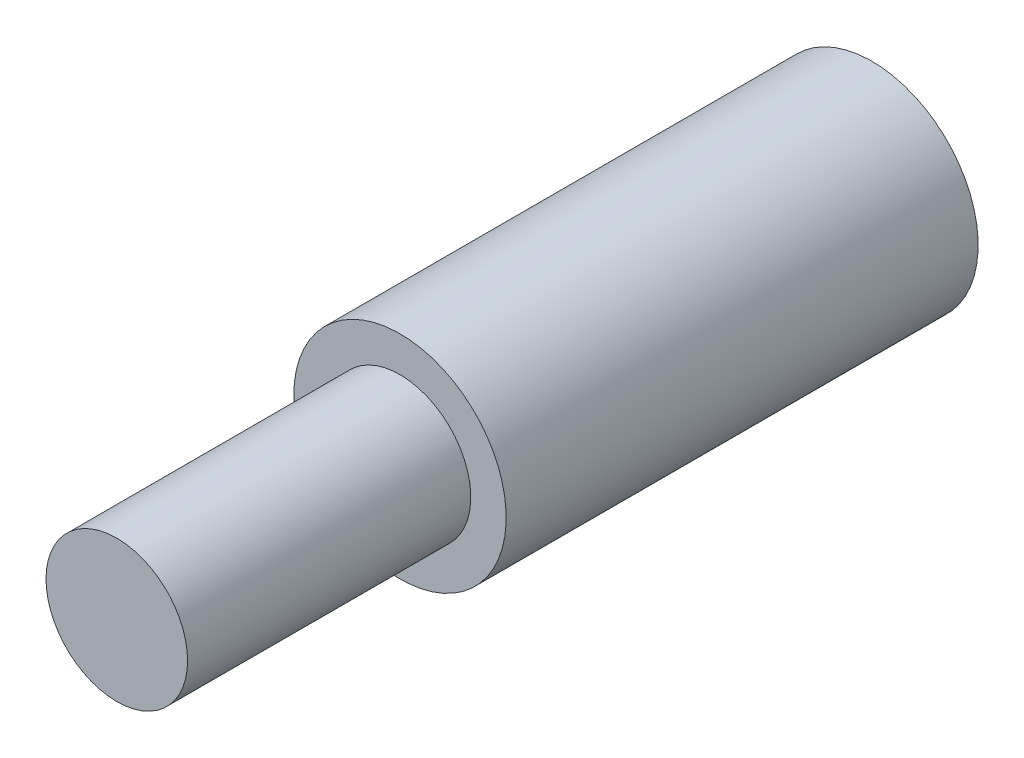
ISO-10303-21;
HEADER;
FILE_DESCRIPTION(('STEP AP214'),'2;1');
FILE_NAME('part.step','',(''),(''),'','','');
FILE_SCHEMA(('AUTOMOTIVE_DESIGN { 1 0 10303 214 1 1 1 1 }'));
ENDSEC;
DATA;
#1=APPLICATION_CONTEXT('core data for automotive mechanical design processes');
#2=APPLICATION_PROTOCOL_DEFINITION('international standard','automotive_design',2000,#1);
#3=PRODUCT_CONTEXT('',#1,'mechanical');
#4=PRODUCT('Part','Part','',(#3));
#5=PRODUCT_RELATED_PRODUCT_CATEGORY('part','',(#4));
#6=PRODUCT_DEFINITION_FORMATION('','',#4);
#7=PRODUCT_DEFINITION_CONTEXT('part definition',#1,'design');
#8=PRODUCT_DEFINITION('design','',#6,#7);
#9=PRODUCT_DEFINITION_SHAPE('','',#8);
#10=(LENGTH_UNIT() NAMED_UNIT(*) SI_UNIT(.MILLI.,.METRE.));
#11=(NAMED_UNIT(*) PLANE_ANGLE_UNIT() SI_UNIT($,.RADIAN.));
#12=(NAMED_UNIT(*) SI_UNIT($,.STERADIAN.) SOLID_ANGLE_UNIT());
#13=UNCERTAINTY_MEASURE_WITH_UNIT(LENGTH_MEASURE(1.E-05),#10,'distance_accuracy_value','');
#14=(GEOMETRIC_REPRESENTATION_CONTEXT(3) GLOBAL_UNCERTAINTY_ASSIGNED_CONTEXT((#13)) GLOBAL_UNIT_ASSIGNED_CONTEXT((#10,
#11,#12)) REPRESENTATION_CONTEXT('',''));
#15=CARTESIAN_POINT('',(0.,0.,0.));
#16=DIRECTION('',(0.,0.,1.));
#17=DIRECTION('',(1.,0.,0.));
#18=AXIS2_PLACEMENT_3D('',#15,#16,#17);
#19=CARTESIAN_POINT('',(0.,0.,6.));
#20=DIRECTION('',(0.,0.,-1.));
#21=DIRECTION('',(-1.,0.,0.));
#22=AXIS2_PLACEMENT_3D('',#19,#20,#21);
#23=CYLINDRICAL_SURFACE('',#22,1.5);
#24=CARTESIAN_POINT('',(0.,0.,6.));
#25=DIRECTION('',(0.,0.,1.));
#26=DIRECTION('',(1.,0.,0.));
#27=AXIS2_PLACEMENT_3D('',#24,#25,#26);
#28=CIRCLE('',#27,1.5);
#29=CARTESIAN_POINT('',(1.5,0.,6.));
#30=VERTEX_POINT('',#29);
#31=EDGE_CURVE('E10',#30,#30,#28,.T.);
#32=ORIENTED_EDGE('',*,*,#31,.F.);
#33=EDGE_LOOP('',(#32));
#34=FACE_BOUND('',#33,.T.);
#35=CARTESIAN_POINT('',(0.,0.,0.));
#36=DIRECTION('',(0.,0.,-1.));
#37=DIRECTION('',(-1.,0.,0.));
#38=AXIS2_PLACEMENT_3D('',#35,#36,#37);
#39=CIRCLE('',#38,1.5);
#40=CARTESIAN_POINT('',(-1.5,0.,0.));
#41=VERTEX_POINT('',#40);
#42=EDGE_CURVE('E42',#41,#41,#39,.T.);
#43=ORIENTED_EDGE('',*,*,#42,.F.);
#44=EDGE_LOOP('',(#43));
#45=FACE_BOUND('',#44,.T.);
#46=ADVANCED_FACE('F36',(#34,#45),#23,.T.);
#47=CARTESIAN_POINT('',(0.,0.,6.));
#48=DIRECTION('',(0.,0.,1.));
#49=DIRECTION('',(1.,0.,0.));
#50=AXIS2_PLACEMENT_3D('',#47,#48,#49);
#51=PLANE('',#50);
#52=ORIENTED_EDGE('',*,*,#31,.T.);
#53=EDGE_LOOP('',(#52));
#54=FACE_BOUND('',#53,.T.);
#55=ADVANCED_FACE('F84',(#54),#51,.T.);
#56=CARTESIAN_POINT('',(0.,0.,0.));
#57=DIRECTION('',(0.,0.,-1.));
#58=DIRECTION('',(-1.,0.,0.));
#59=AXIS2_PLACEMENT_3D('',#56,#57,#58);
#60=PLANE('',#59);
#61=CARTESIAN_POINT('',(0.,0.,0.));
#62=DIRECTION('',(0.,0.,-1.));
#63=DIRECTION('',(-1.,0.,0.));
#64=AXIS2_PLACEMENT_3D('',#61,#62,#63);
#65=CIRCLE('',#64,2.25);
#66=CARTESIAN_POINT('',(-2.25,0.,0.));
#67=VERTEX_POINT('',#66);
#68=EDGE_CURVE('E50',#67,#67,#65,.T.);
#69=ORIENTED_EDGE('',*,*,#68,.F.);
#70=EDGE_LOOP('',(#69));
#71=FACE_BOUND('',#70,.T.);
#72=ORIENTED_EDGE('',*,*,#42,.T.);
#73=EDGE_LOOP('',(#72));
#74=FACE_BOUND('',#73,.T.);
#75=ADVANCED_FACE('F79',(#71,#74),#60,.F.);
#76=CARTESIAN_POINT('',(0.,0.,-10.));
#77=DIRECTION('',(0.,0.,1.));
#78=DIRECTION('',(1.,0.,0.));
#79=AXIS2_PLACEMENT_3D('',#76,#77,#78);
#80=CYLINDRICAL_SURFACE('',#79,2.25);
#81=CARTESIAN_POINT('',(0.,0.,-10.));
#82=DIRECTION('',(0.,0.,-1.));
#83=DIRECTION('',(-1.,0.,0.));
#84=AXIS2_PLACEMENT_3D('',#81,#82,#83);
#85=CIRCLE('',#84,2.25);
#86=CARTESIAN_POINT('',(-2.25,0.,-10.));
#87=VERTEX_POINT('',#86);
#88=EDGE_CURVE('E46',#87,#87,#85,.T.);
#89=ORIENTED_EDGE('',*,*,#88,.F.);
#90=EDGE_LOOP('',(#89));
#91=FACE_BOUND('',#90,.T.);
#92=ORIENTED_EDGE('',*,*,#68,.T.);
#93=EDGE_LOOP('',(#92));
#94=FACE_BOUND('',#93,.T.);
#95=ADVANCED_FACE('F73',(#91,#94),#80,.T.);
#96=CARTESIAN_POINT('',(0.,0.,-10.));
#97=DIRECTION('',(0.,0.,-1.));
#98=DIRECTION('',(-1.,0.,0.));
#99=AXIS2_PLACEMENT_3D('',#96,#97,#98);
#100=PLANE('',#99);
#101=CARTESIAN_POINT('',(0.,0.,-10.));
#102=DIRECTION('',(0.,0.,-1.));
#103=DIRECTION('',(-1.,0.,0.));
#104=AXIS2_PLACEMENT_3D('',#101,#102,#103);
#105=CIRCLE('',#104,1.5);
#106=CARTESIAN_POINT('',(-1.5,0.,-10.));
#107=VERTEX_POINT('',#106);
#108=EDGE_CURVE('E56',#107,#107,#105,.T.);
#109=ORIENTED_EDGE('',*,*,#108,.F.);
#110=EDGE_LOOP('',(#109));
#111=FACE_BOUND('',#110,.T.);
#112=ORIENTED_EDGE('',*,*,#88,.T.);
#113=EDGE_LOOP('',(#112));
#114=FACE_BOUND('',#113,.T.);
#115=ADVANCED_FACE('F67',(#111,#114),#100,.T.);
#116=CARTESIAN_POINT('',(0.,0.,-5.5));
#117=DIRECTION('',(0.,0.,-1.));
#118=DIRECTION('',(-1.,0.,0.));
#119=AXIS2_PLACEMENT_3D('',#116,#117,#118);
#120=CYLINDRICAL_SURFACE('',#119,1.5);
#121=CARTESIAN_POINT('',(0.,0.,-5.5));
#122=DIRECTION('',(0.,0.,-1.));
#123=DIRECTION('',(-1.,0.,0.));
#124=AXIS2_PLACEMENT_3D('',#121,#122,#123);
#125=CIRCLE('',#124,1.5);
#126=CARTESIAN_POINT('',(-1.5,0.,-5.5));
#127=VERTEX_POINT('',#126);
#128=EDGE_CURVE('E54',#127,#127,#125,.T.);
#129=ORIENTED_EDGE('',*,*,#128,.F.);
#130=EDGE_LOOP('',(#129));
#131=FACE_BOUND('',#130,.T.);
#132=ORIENTED_EDGE('',*,*,#108,.T.);
#133=EDGE_LOOP('',(#132));
#134=FACE_BOUND('',#133,.T.);
#135=ADVANCED_FACE('F64',(#131,#134),#120,.F.);
#136=CARTESIAN_POINT('',(0.,0.,-5.5));
#137=DIRECTION('',(0.,0.,-1.));
#138=DIRECTION('',(-1.,0.,0.));
#139=AXIS2_PLACEMENT_3D('',#136,#137,#138);
#140=PLANE('',#139);
#141=ORIENTED_EDGE('',*,*,#128,.T.);
#142=EDGE_LOOP('',(#141));
#143=FACE_BOUND('',#142,.T.);
#144=ADVANCED_FACE('F62',(#143),#140,.T.);
#145=CLOSED_SHELL('',(#46,#55,#75,#95,#115,#135,#144));
#146=MANIFOLD_SOLID_BREP('B2',#145);
#147=ADVANCED_BREP_SHAPE_REPRESENTATION('',(#18,#146),#14);
#148=SHAPE_DEFINITION_REPRESENTATION(#9,#147);
ENDSEC;
END-ISO-10303-21;
